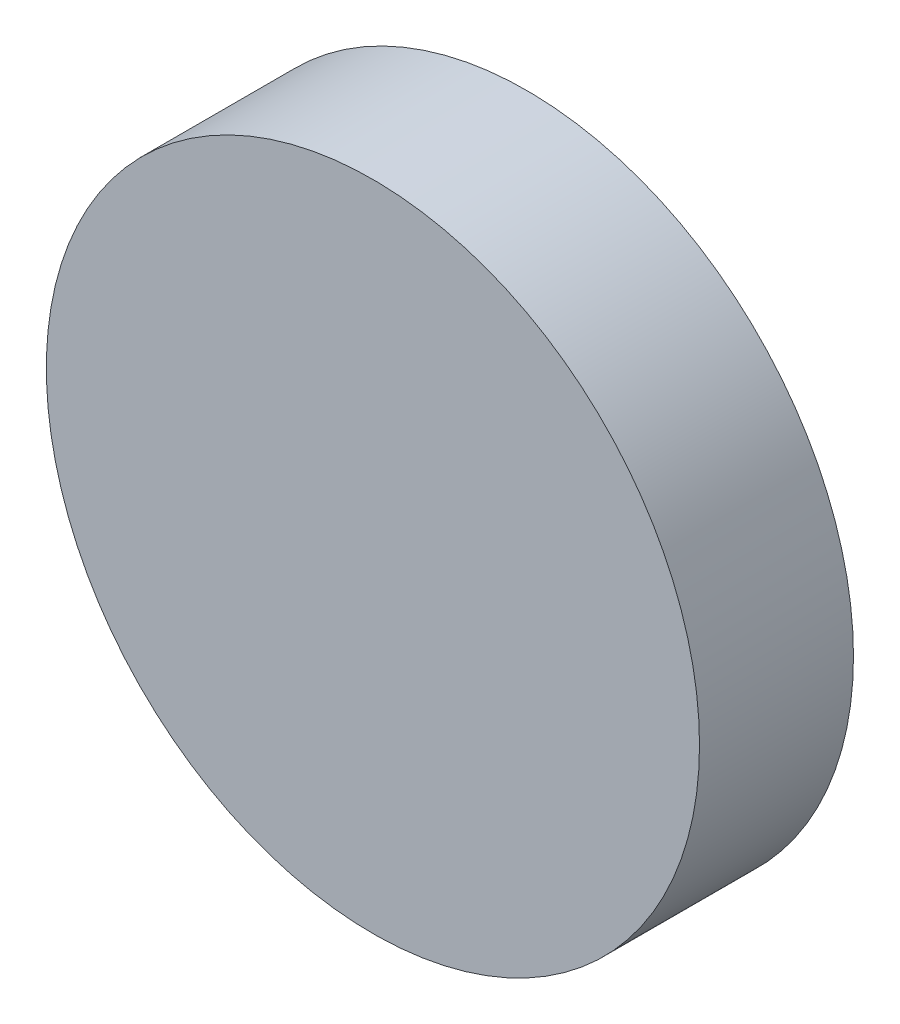
ISO-10303-21;
HEADER;
FILE_DESCRIPTION(('STEP AP214'),'2;1');
FILE_NAME('part.step','',(''),(''),'','','');
FILE_SCHEMA(('AUTOMOTIVE_DESIGN { 1 0 10303 214 1 1 1 1 }'));
ENDSEC;
DATA;
#1=APPLICATION_CONTEXT('core data for automotive mechanical design processes');
#2=APPLICATION_PROTOCOL_DEFINITION('international standard','automotive_design',2000,#1);
#3=PRODUCT_CONTEXT('',#1,'mechanical');
#4=PRODUCT('Part','Part','',(#3));
#5=PRODUCT_RELATED_PRODUCT_CATEGORY('part','',(#4));
#6=PRODUCT_DEFINITION_FORMATION('','',#4);
#7=PRODUCT_DEFINITION_CONTEXT('part definition',#1,'design');
#8=PRODUCT_DEFINITION('design','',#6,#7);
#9=PRODUCT_DEFINITION_SHAPE('','',#8);
#10=(LENGTH_UNIT() NAMED_UNIT(*) SI_UNIT(.MILLI.,.METRE.));
#11=(NAMED_UNIT(*) PLANE_ANGLE_UNIT() SI_UNIT($,.RADIAN.));
#12=(NAMED_UNIT(*) SI_UNIT($,.STERADIAN.) SOLID_ANGLE_UNIT());
#13=UNCERTAINTY_MEASURE_WITH_UNIT(LENGTH_MEASURE(1.E-05),#10,'distance_accuracy_value','');
#14=(GEOMETRIC_REPRESENTATION_CONTEXT(3) GLOBAL_UNCERTAINTY_ASSIGNED_CONTEXT((#13)) GLOBAL_UNIT_ASSIGNED_CONTEXT((#10,
#11,#12)) REPRESENTATION_CONTEXT('',''));
#15=CARTESIAN_POINT('',(0.,0.,0.));
#16=DIRECTION('',(0.,0.,1.));
#17=DIRECTION('',(1.,0.,0.));
#18=AXIS2_PLACEMENT_3D('',#15,#16,#17);
#19=CARTESIAN_POINT('',(0.,0.,33.));
#20=DIRECTION('',(0.,0.,-1.));
#21=DIRECTION('',(-1.,0.,0.));
#22=AXIS2_PLACEMENT_3D('',#19,#20,#21);
#23=CYLINDRICAL_SURFACE('',#22,70.);
#24=CARTESIAN_POINT('',(0.,0.,33.));
#25=DIRECTION('',(0.,0.,1.));
#26=DIRECTION('',(1.,0.,0.));
#27=AXIS2_PLACEMENT_3D('',#24,#25,#26);
#28=CIRCLE('',#27,70.);
#29=CARTESIAN_POINT('',(70.,0.,33.));
#30=VERTEX_POINT('',#29);
#31=EDGE_CURVE('E10',#30,#30,#28,.T.);
#32=ORIENTED_EDGE('',*,*,#31,.F.);
#33=EDGE_LOOP('',(#32));
#34=FACE_BOUND('',#33,.T.);
#35=CARTESIAN_POINT('',(0.,0.,0.));
#36=DIRECTION('',(0.,0.,1.));
#37=DIRECTION('',(1.,0.,0.));
#38=AXIS2_PLACEMENT_3D('',#35,#36,#37);
#39=CIRCLE('',#38,70.);
#40=CARTESIAN_POINT('',(70.,0.,0.));
#41=VERTEX_POINT('',#40);
#42=EDGE_CURVE('E40',#41,#41,#39,.T.);
#43=ORIENTED_EDGE('',*,*,#42,.T.);
#44=EDGE_LOOP('',(#43));
#45=FACE_BOUND('',#44,.T.);
#46=ADVANCED_FACE('F37',(#34,#45),#23,.T.);
#47=CARTESIAN_POINT('',(0.,0.,33.));
#48=DIRECTION('',(0.,0.,1.));
#49=DIRECTION('',(1.,0.,0.));
#50=AXIS2_PLACEMENT_3D('',#47,#48,#49);
#51=PLANE('',#50);
#52=ORIENTED_EDGE('',*,*,#31,.T.);
#53=EDGE_LOOP('',(#52));
#54=FACE_BOUND('',#53,.T.);
#55=ADVANCED_FACE('F52',(#54),#51,.T.);
#56=CARTESIAN_POINT('',(0.,0.,0.));
#57=DIRECTION('',(0.,0.,1.));
#58=DIRECTION('',(1.,0.,0.));
#59=AXIS2_PLACEMENT_3D('',#56,#57,#58);
#60=PLANE('',#59);
#61=ORIENTED_EDGE('',*,*,#42,.F.);
#62=EDGE_LOOP('',(#61));
#63=FACE_BOUND('',#62,.T.);
#64=ADVANCED_FACE('F50',(#63),#60,.F.);
#65=CLOSED_SHELL('',(#46,#55,#64));
#66=MANIFOLD_SOLID_BREP('B2',#65);
#67=ADVANCED_BREP_SHAPE_REPRESENTATION('',(#18,#66),#14);
#68=SHAPE_DEFINITION_REPRESENTATION(#9,#67);
ENDSEC;
END-ISO-10303-21;
